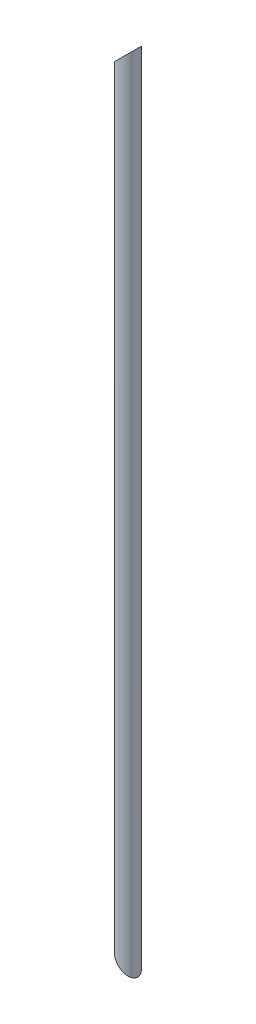
ISO-10303-21;
HEADER;
FILE_DESCRIPTION(('STEP AP214'),'2;1');
FILE_NAME('part.step','',(''),(''),'','','');
FILE_SCHEMA(('AUTOMOTIVE_DESIGN { 1 0 10303 214 1 1 1 1 }'));
ENDSEC;
DATA;
#1=APPLICATION_CONTEXT('core data for automotive mechanical design processes');
#2=APPLICATION_PROTOCOL_DEFINITION('international standard','automotive_design',2000,#1);
#3=PRODUCT_CONTEXT('',#1,'mechanical');
#4=PRODUCT('Part','Part','',(#3));
#5=PRODUCT_RELATED_PRODUCT_CATEGORY('part','',(#4));
#6=PRODUCT_DEFINITION_FORMATION('','',#4);
#7=PRODUCT_DEFINITION_CONTEXT('part definition',#1,'design');
#8=PRODUCT_DEFINITION('design','',#6,#7);
#9=PRODUCT_DEFINITION_SHAPE('','',#8);
#10=(LENGTH_UNIT() NAMED_UNIT(*) SI_UNIT(.MILLI.,.METRE.));
#11=(NAMED_UNIT(*) PLANE_ANGLE_UNIT() SI_UNIT($,.RADIAN.));
#12=(NAMED_UNIT(*) SI_UNIT($,.STERADIAN.) SOLID_ANGLE_UNIT());
#13=UNCERTAINTY_MEASURE_WITH_UNIT(LENGTH_MEASURE(1.E-05),#10,'distance_accuracy_value','');
#14=(GEOMETRIC_REPRESENTATION_CONTEXT(3) GLOBAL_UNCERTAINTY_ASSIGNED_CONTEXT((#13)) GLOBAL_UNIT_ASSIGNED_CONTEXT((#10,
#11,#12)) REPRESENTATION_CONTEXT('',''));
#15=CARTESIAN_POINT('',(0.,0.,0.));
#16=DIRECTION('',(0.,0.,1.));
#17=DIRECTION('',(1.,0.,0.));
#18=AXIS2_PLACEMENT_3D('',#15,#16,#17);
#19=CARTESIAN_POINT('',(0.,0.,0.));
#20=DIRECTION('',(0.,-1.,0.));
#21=DIRECTION('',(1.,0.,0.));
#22=AXIS2_PLACEMENT_3D('',#19,#20,#21);
#23=CYLINDRICAL_SURFACE('',#22,31.75);
#24=CARTESIAN_POINT('',(-7.95267939552072E-13,2618.25,0.));
#25=DIRECTION('',(0.707106781186547,-0.707106781186548,0.));
#26=DIRECTION('',(-0.707106781186548,-0.707106781186547,0.));
#27=AXIS2_PLACEMENT_3D('',#24,#25,#26);
#28=ELLIPSE('',#27,44.9012806053457,31.75);
#29=CARTESIAN_POINT('',(-31.7500000000008,2586.5,0.));
#30=VERTEX_POINT('',#29);
#31=EDGE_CURVE('E38',#30,#30,#28,.F.);
#32=ORIENTED_EDGE('',*,*,#31,.F.);
#33=EDGE_LOOP('',(#32));
#34=FACE_BOUND('',#33,.T.);
#35=CARTESIAN_POINT('',(0.,31.7499999999998,0.));
#36=DIRECTION('',(0.707106781186543,0.707106781186552,0.));
#37=DIRECTION('',(0.707106781186552,-0.707106781186543,0.));
#38=AXIS2_PLACEMENT_3D('',#35,#36,#37);
#39=ELLIPSE('',#38,44.9012806053455,31.75);
#40=CARTESIAN_POINT('',(31.75,1.52655665885959E-13,0.));
#41=VERTEX_POINT('',#40);
#42=EDGE_CURVE('E10',#41,#41,#39,.F.);
#43=ORIENTED_EDGE('',*,*,#42,.F.);
#44=EDGE_LOOP('',(#43));
#45=FACE_BOUND('',#44,.T.);
#46=ADVANCED_FACE('F31',(#34,#45),#23,.T.);
#47=CARTESIAN_POINT('',(31.7500000000002,0.,-31.75));
#48=DIRECTION('',(0.707106781186543,0.707106781186552,0.));
#49=DIRECTION('',(-0.707106781186552,0.707106781186543,0.));
#50=AXIS2_PLACEMENT_3D('',#47,#48,#49);
#51=PLANE('',#50);
#52=CARTESIAN_POINT('',(0.,31.7500000000002,0.));
#53=DIRECTION('',(0.707106781186543,0.707106781186552,0.));
#54=DIRECTION('',(0.707106781186552,-0.707106781186543,0.));
#55=AXIS2_PLACEMENT_3D('',#52,#53,#54);
#56=ELLIPSE('',#55,43.4870670429724,30.75);
#57=CARTESIAN_POINT('',(30.75,1.00000000000054,0.));
#58=VERTEX_POINT('',#57);
#59=EDGE_CURVE('E42',#58,#58,#56,.F.);
#60=ORIENTED_EDGE('',*,*,#59,.F.);
#61=EDGE_LOOP('',(#60));
#62=FACE_BOUND('',#61,.T.);
#63=ORIENTED_EDGE('',*,*,#42,.T.);
#64=EDGE_LOOP('',(#63));
#65=FACE_BOUND('',#64,.T.);
#66=ADVANCED_FACE('F56',(#62,#65),#51,.F.);
#67=CARTESIAN_POINT('',(31.7499999999992,2650.,-31.75));
#68=DIRECTION('',(0.707106781186547,-0.707106781186548,0.));
#69=DIRECTION('',(0.707106781186548,0.707106781186547,0.));
#70=AXIS2_PLACEMENT_3D('',#67,#68,#69);
#71=PLANE('',#70);
#72=CARTESIAN_POINT('',(0.,2618.25,0.));
#73=DIRECTION('',(0.707106781186547,-0.707106781186548,0.));
#74=DIRECTION('',(-0.707106781186548,-0.707106781186547,0.));
#75=AXIS2_PLACEMENT_3D('',#72,#73,#74);
#76=ELLIPSE('',#75,43.4870670429726,30.75);
#77=CARTESIAN_POINT('',(-30.75,2587.5,0.));
#78=VERTEX_POINT('',#77);
#79=EDGE_CURVE('E34',#78,#78,#76,.F.);
#80=ORIENTED_EDGE('',*,*,#79,.F.);
#81=EDGE_LOOP('',(#80));
#82=FACE_BOUND('',#81,.T.);
#83=ORIENTED_EDGE('',*,*,#31,.T.);
#84=EDGE_LOOP('',(#83));
#85=FACE_BOUND('',#84,.T.);
#86=ADVANCED_FACE('F53',(#82,#85),#71,.F.);
#87=CARTESIAN_POINT('',(0.,2650.,0.));
#88=DIRECTION('',(0.,-1.,0.));
#89=DIRECTION('',(0.,0.,-1.));
#90=AXIS2_PLACEMENT_3D('',#87,#88,#89);
#91=CYLINDRICAL_SURFACE('',#90,30.75);
#92=ORIENTED_EDGE('',*,*,#79,.T.);
#93=EDGE_LOOP('',(#92));
#94=FACE_BOUND('',#93,.T.);
#95=ORIENTED_EDGE('',*,*,#59,.T.);
#96=EDGE_LOOP('',(#95));
#97=FACE_BOUND('',#96,.T.);
#98=ADVANCED_FACE('F51',(#94,#97),#91,.F.);
#99=CLOSED_SHELL('',(#46,#66,#86,#98));
#100=MANIFOLD_SOLID_BREP('B2',#99);
#101=ADVANCED_BREP_SHAPE_REPRESENTATION('',(#18,#100),#14);
#102=SHAPE_DEFINITION_REPRESENTATION(#9,#101);
ENDSEC;
END-ISO-10303-21;
